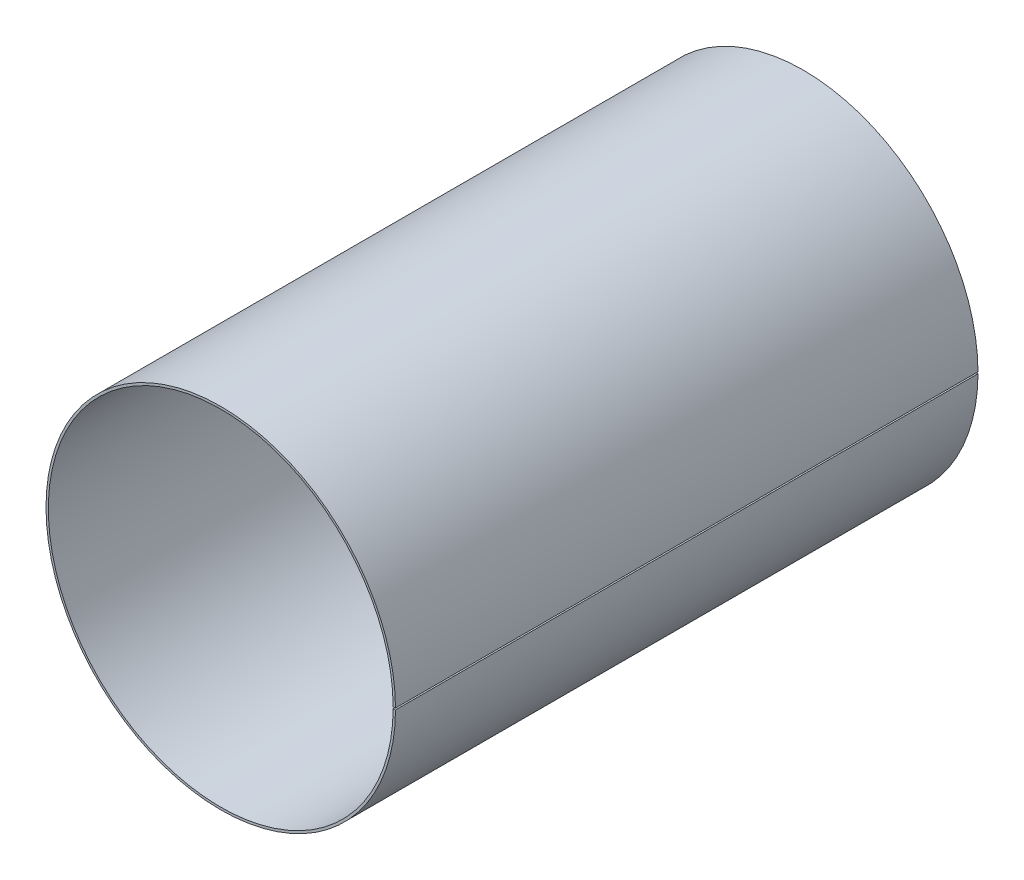
ISO-10303-21;
HEADER;
FILE_DESCRIPTION(('STEP AP214'),'2;1');
FILE_NAME('part.step','',(''),(''),'','','');
FILE_SCHEMA(('AUTOMOTIVE_DESIGN { 1 0 10303 214 1 1 1 1 }'));
ENDSEC;
DATA;
#1=APPLICATION_CONTEXT('core data for automotive mechanical design processes');
#2=APPLICATION_PROTOCOL_DEFINITION('international standard','automotive_design',2000,#1);
#3=PRODUCT_CONTEXT('',#1,'mechanical');
#4=PRODUCT('Part','Part','',(#3));
#5=PRODUCT_RELATED_PRODUCT_CATEGORY('part','',(#4));
#6=PRODUCT_DEFINITION_FORMATION('','',#4);
#7=PRODUCT_DEFINITION_CONTEXT('part definition',#1,'design');
#8=PRODUCT_DEFINITION('design','',#6,#7);
#9=PRODUCT_DEFINITION_SHAPE('','',#8);
#10=(LENGTH_UNIT() NAMED_UNIT(*) SI_UNIT(.MILLI.,.METRE.));
#11=(NAMED_UNIT(*) PLANE_ANGLE_UNIT() SI_UNIT($,.RADIAN.));
#12=(NAMED_UNIT(*) SI_UNIT($,.STERADIAN.) SOLID_ANGLE_UNIT());
#13=UNCERTAINTY_MEASURE_WITH_UNIT(LENGTH_MEASURE(1.E-05),#10,'distance_accuracy_value','');
#14=(GEOMETRIC_REPRESENTATION_CONTEXT(3) GLOBAL_UNCERTAINTY_ASSIGNED_CONTEXT((#13)) GLOBAL_UNIT_ASSIGNED_CONTEXT((#10,
#11,#12)) REPRESENTATION_CONTEXT('',''));
#15=CARTESIAN_POINT('',(0.,0.,0.));
#16=DIRECTION('',(0.,0.,1.));
#17=DIRECTION('',(1.,0.,0.));
#18=AXIS2_PLACEMENT_3D('',#15,#16,#17);
#19=CARTESIAN_POINT('',(148.998466561226,0.675989943192271,250.));
#20=DIRECTION('',(-0.00453684525632432,0.999989708464602,0.));
#21=DIRECTION('',(0.,0.,1.));
#22=AXIS2_PLACEMENT_3D('',#19,#20,#21);
#23=PLANE('',#22);
#24=DIRECTION('',(0.999989708464602,0.00453684525632432,0.));
#25=VECTOR('',#24,1.);
#26=CARTESIAN_POINT('',(148.998466561226,0.675989943192271,500.));
#27=LINE('',#26,#25);
#28=CARTESIAN_POINT('',(147.998476852761,0.671453097935926,500.));
#29=VERTEX_POINT('',#28);
#30=CARTESIAN_POINT('',(149.99845626969,0.680526788448574,500.));
#31=VERTEX_POINT('',#30);
#32=EDGE_CURVE('E11',#29,#31,#27,.T.);
#33=ORIENTED_EDGE('',*,*,#32,.F.);
#34=DIRECTION('',(0.,0.,-1.));
#35=VECTOR('',#34,1.);
#36=CARTESIAN_POINT('',(147.998476852761,0.671453097935926,1560.17388450519));
#37=LINE('',#36,#35);
#38=CARTESIAN_POINT('',(147.998476852761,0.671453097935991,0.));
#39=VERTEX_POINT('',#38);
#40=EDGE_CURVE('E81',#39,#29,#37,.F.);
#41=ORIENTED_EDGE('',*,*,#40,.F.);
#42=DIRECTION('',(0.999989708464602,0.00453684525632456,0.));
#43=VECTOR('',#42,1.);
#44=CARTESIAN_POINT('',(148.998466561226,0.675989943192307,0.));
#45=LINE('',#44,#43);
#46=CARTESIAN_POINT('',(149.99845626969,0.680526788448641,0.));
#47=VERTEX_POINT('',#46);
#48=EDGE_CURVE('E43',#39,#47,#45,.T.);
#49=ORIENTED_EDGE('',*,*,#48,.T.);
#50=DIRECTION('',(0.,0.,-1.));
#51=VECTOR('',#50,1.);
#52=CARTESIAN_POINT('',(149.99845626969,0.680526788448574,1560.17388450519));
#53=LINE('',#52,#51);
#54=EDGE_CURVE('E80',#47,#31,#53,.F.);
#55=ORIENTED_EDGE('',*,*,#54,.T.);
#56=EDGE_LOOP('',(#33,#41,#49,#55));
#57=FACE_BOUND('',#56,.T.);
#58=ADVANCED_FACE('F33',(#57),#23,.F.);
#59=CARTESIAN_POINT('',(0.,0.,0.));
#60=DIRECTION('',(0.,0.,1.));
#61=DIRECTION('',(0.,-1.,0.));
#62=AXIS2_PLACEMENT_3D('',#59,#60,#61);
#63=PLANE('',#62);
#64=ORIENTED_EDGE('',*,*,#48,.F.);
#65=CARTESIAN_POINT('',(0.,0.,0.));
#66=DIRECTION('',(0.,0.,-1.));
#67=DIRECTION('',(-1.,0.,0.));
#68=AXIS2_PLACEMENT_3D('',#65,#66,#67);
#69=CIRCLE('',#68,148.);
#70=CARTESIAN_POINT('',(147.998476852761,-0.671453097933891,0.));
#71=VERTEX_POINT('',#70);
#72=EDGE_CURVE('E101',#71,#39,#69,.T.);
#73=ORIENTED_EDGE('',*,*,#72,.F.);
#74=DIRECTION('',(0.999989708464602,-0.00453684525631,0.));
#75=VECTOR('',#74,1.);
#76=CARTESIAN_POINT('',(148.998466561226,-0.675989943190243,0.));
#77=LINE('',#76,#75);
#78=CARTESIAN_POINT('',(149.99845626969,-0.68052678844651,0.));
#79=VERTEX_POINT('',#78);
#80=EDGE_CURVE('E76',#71,#79,#77,.T.);
#81=ORIENTED_EDGE('',*,*,#80,.T.);
#82=CARTESIAN_POINT('',(0.,0.,0.));
#83=DIRECTION('',(0.,0.,-1.));
#84=DIRECTION('',(-1.,0.,0.));
#85=AXIS2_PLACEMENT_3D('',#82,#83,#84);
#86=CIRCLE('',#85,150.);
#87=EDGE_CURVE('E88',#79,#47,#86,.T.);
#88=ORIENTED_EDGE('',*,*,#87,.T.);
#89=EDGE_LOOP('',(#64,#73,#81,#88));
#90=FACE_BOUND('',#89,.T.);
#91=ADVANCED_FACE('F91',(#90),#63,.F.);
#92=CARTESIAN_POINT('',(148.998466561226,-0.675989943190237,250.));
#93=DIRECTION('',(-0.00453684525630996,-0.999989708464602,0.));
#94=DIRECTION('',(0.,0.,-1.));
#95=AXIS2_PLACEMENT_3D('',#92,#93,#94);
#96=PLANE('',#95);
#97=ORIENTED_EDGE('',*,*,#80,.F.);
#98=DIRECTION('',(0.,0.,-1.));
#99=VECTOR('',#98,1.);
#100=CARTESIAN_POINT('',(147.998476852761,-0.671453097933891,1560.17388450519));
#101=LINE('',#100,#99);
#102=CARTESIAN_POINT('',(147.998476852761,-0.671453097933956,500.));
#103=VERTEX_POINT('',#102);
#104=EDGE_CURVE('E92',#103,#71,#101,.T.);
#105=ORIENTED_EDGE('',*,*,#104,.F.);
#106=DIRECTION('',(0.999989708464602,-0.00453684525631053,0.));
#107=VECTOR('',#106,1.);
#108=CARTESIAN_POINT('',(148.998466561226,-0.675989943190321,500.));
#109=LINE('',#108,#107);
#110=CARTESIAN_POINT('',(149.99845626969,-0.680526788446577,500.));
#111=VERTEX_POINT('',#110);
#112=EDGE_CURVE('E37',#103,#111,#109,.T.);
#113=ORIENTED_EDGE('',*,*,#112,.T.);
#114=DIRECTION('',(0.,0.,-1.));
#115=VECTOR('',#114,1.);
#116=CARTESIAN_POINT('',(149.99845626969,-0.68052678844651,1560.17388450519));
#117=LINE('',#116,#115);
#118=EDGE_CURVE('E98',#111,#79,#117,.T.);
#119=ORIENTED_EDGE('',*,*,#118,.T.);
#120=EDGE_LOOP('',(#97,#105,#113,#119));
#121=FACE_BOUND('',#120,.T.);
#122=ADVANCED_FACE('F105',(#121),#96,.F.);
#123=CARTESIAN_POINT('',(0.,0.,500.));
#124=DIRECTION('',(0.,0.,-1.));
#125=DIRECTION('',(-1.,0.,0.));
#126=AXIS2_PLACEMENT_3D('',#123,#124,#125);
#127=PLANE('',#126);
#128=CARTESIAN_POINT('',(0.,0.,500.));
#129=DIRECTION('',(0.,0.,-1.));
#130=DIRECTION('',(-1.,0.,0.));
#131=AXIS2_PLACEMENT_3D('',#128,#129,#130);
#132=CIRCLE('',#131,148.);
#133=EDGE_CURVE('E95',#29,#103,#132,.F.);
#134=ORIENTED_EDGE('',*,*,#133,.F.);
#135=ORIENTED_EDGE('',*,*,#32,.T.);
#136=CARTESIAN_POINT('',(0.,0.,500.));
#137=DIRECTION('',(0.,0.,-1.));
#138=DIRECTION('',(-1.,0.,0.));
#139=AXIS2_PLACEMENT_3D('',#136,#137,#138);
#140=CIRCLE('',#139,150.);
#141=EDGE_CURVE('E89',#31,#111,#140,.F.);
#142=ORIENTED_EDGE('',*,*,#141,.T.);
#143=ORIENTED_EDGE('',*,*,#112,.F.);
#144=EDGE_LOOP('',(#134,#135,#142,#143));
#145=FACE_BOUND('',#144,.T.);
#146=ADVANCED_FACE('F35',(#145),#127,.F.);
#147=CARTESIAN_POINT('',(0.,0.,1560.17388450519));
#148=DIRECTION('',(0.,0.,-1.));
#149=DIRECTION('',(-1.,0.,0.));
#150=AXIS2_PLACEMENT_3D('',#147,#148,#149);
#151=CYLINDRICAL_SURFACE('',#150,150.);
#152=ORIENTED_EDGE('',*,*,#118,.F.);
#153=ORIENTED_EDGE('',*,*,#141,.F.);
#154=ORIENTED_EDGE('',*,*,#54,.F.);
#155=ORIENTED_EDGE('',*,*,#87,.F.);
#156=EDGE_LOOP('',(#152,#153,#154,#155));
#157=FACE_BOUND('',#156,.T.);
#158=ADVANCED_FACE('F87',(#157),#151,.T.);
#159=CARTESIAN_POINT('',(0.,0.,1560.17388450519));
#160=DIRECTION('',(0.,0.,-1.));
#161=DIRECTION('',(-1.,0.,0.));
#162=AXIS2_PLACEMENT_3D('',#159,#160,#161);
#163=CYLINDRICAL_SURFACE('',#162,148.);
#164=ORIENTED_EDGE('',*,*,#104,.T.);
#165=ORIENTED_EDGE('',*,*,#72,.T.);
#166=ORIENTED_EDGE('',*,*,#40,.T.);
#167=ORIENTED_EDGE('',*,*,#133,.T.);
#168=EDGE_LOOP('',(#164,#165,#166,#167));
#169=FACE_BOUND('',#168,.T.);
#170=ADVANCED_FACE('F107',(#169),#163,.F.);
#171=CLOSED_SHELL('',(#58,#91,#122,#146,#158,#170));
#172=MANIFOLD_SOLID_BREP('B2',#171);
#173=ADVANCED_BREP_SHAPE_REPRESENTATION('',(#18,#172),#14);
#174=SHAPE_DEFINITION_REPRESENTATION(#9,#173);
ENDSEC;
END-ISO-10303-21;
